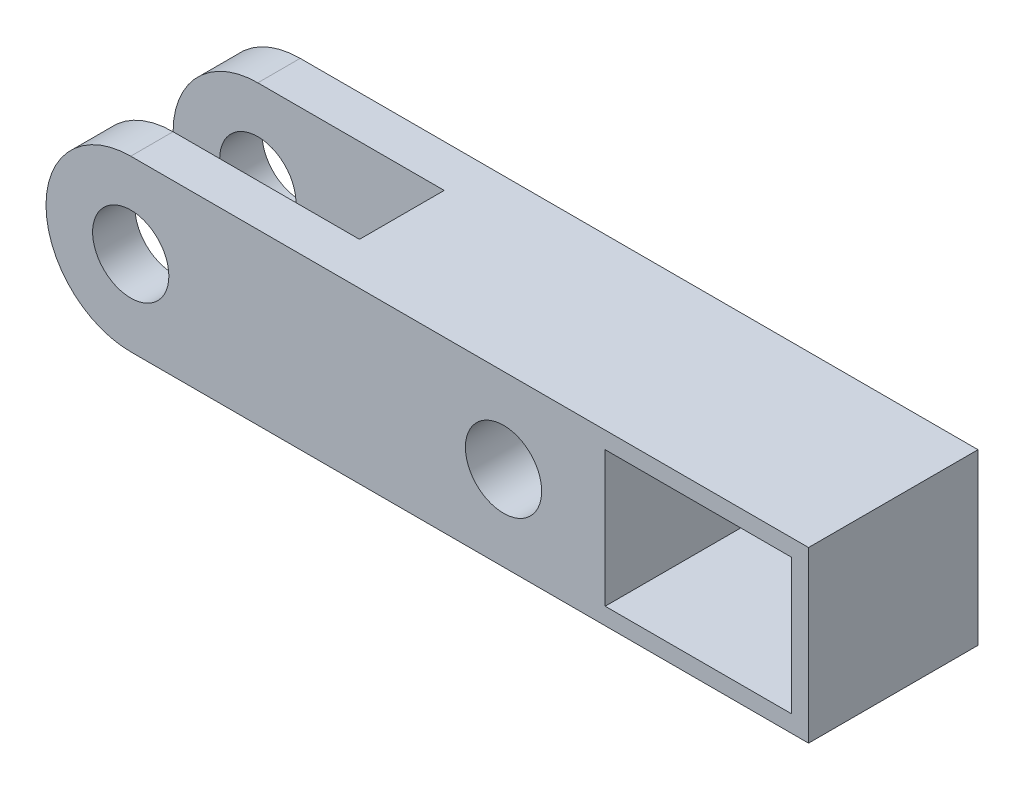
ISO-10303-21;
HEADER;
FILE_DESCRIPTION(('STEP AP214'),'2;1');
FILE_NAME('part.step','',(''),(''),'','','');
FILE_SCHEMA(('AUTOMOTIVE_DESIGN { 1 0 10303 214 1 1 1 1 }'));
ENDSEC;
DATA;
#1=APPLICATION_CONTEXT('core data for automotive mechanical design processes');
#2=APPLICATION_PROTOCOL_DEFINITION('international standard','automotive_design',2000,#1);
#3=PRODUCT_CONTEXT('',#1,'mechanical');
#4=PRODUCT('Part','Part','',(#3));
#5=PRODUCT_RELATED_PRODUCT_CATEGORY('part','',(#4));
#6=PRODUCT_DEFINITION_FORMATION('','',#4);
#7=PRODUCT_DEFINITION_CONTEXT('part definition',#1,'design');
#8=PRODUCT_DEFINITION('design','',#6,#7);
#9=PRODUCT_DEFINITION_SHAPE('','',#8);
#10=(LENGTH_UNIT() NAMED_UNIT(*) SI_UNIT(.MILLI.,.METRE.));
#11=(NAMED_UNIT(*) PLANE_ANGLE_UNIT() SI_UNIT($,.RADIAN.));
#12=(NAMED_UNIT(*) SI_UNIT($,.STERADIAN.) SOLID_ANGLE_UNIT());
#13=UNCERTAINTY_MEASURE_WITH_UNIT(LENGTH_MEASURE(1.E-05),#10,'distance_accuracy_value','');
#14=(GEOMETRIC_REPRESENTATION_CONTEXT(3) GLOBAL_UNCERTAINTY_ASSIGNED_CONTEXT((#13)) GLOBAL_UNIT_ASSIGNED_CONTEXT((#10,
#11,#12)) REPRESENTATION_CONTEXT('',''));
#15=CARTESIAN_POINT('',(0.,0.,0.));
#16=DIRECTION('',(0.,0.,1.));
#17=DIRECTION('',(1.,0.,0.));
#18=AXIS2_PLACEMENT_3D('',#15,#16,#17);
#19=CARTESIAN_POINT('',(0.,0.,5.));
#20=DIRECTION('',(0.,0.,-1.));
#21=DIRECTION('',(-1.,0.,0.));
#22=AXIS2_PLACEMENT_3D('',#19,#20,#21);
#23=CYLINDRICAL_SURFACE('',#22,5.);
#24=DIRECTION('',(0.,0.,-1.));
#25=VECTOR('',#24,1.);
#26=CARTESIAN_POINT('',(0.,5.,5.));
#27=LINE('',#26,#25);
#28=CARTESIAN_POINT('',(0.,5.,5.));
#29=VERTEX_POINT('',#28);
#30=CARTESIAN_POINT('',(0.,5.,2.5));
#31=VERTEX_POINT('',#30);
#32=EDGE_CURVE('E227',#29,#31,#27,.T.);
#33=ORIENTED_EDGE('',*,*,#32,.T.);
#34=CARTESIAN_POINT('',(0.,0.,2.5));
#35=DIRECTION('',(0.,0.,1.));
#36=DIRECTION('',(1.,0.,0.));
#37=AXIS2_PLACEMENT_3D('',#34,#35,#36);
#38=CIRCLE('',#37,5.);
#39=CARTESIAN_POINT('',(0.,-5.,2.5));
#40=VERTEX_POINT('',#39);
#41=EDGE_CURVE('E146',#31,#40,#38,.T.);
#42=ORIENTED_EDGE('',*,*,#41,.T.);
#43=DIRECTION('',(0.,0.,-1.));
#44=VECTOR('',#43,1.);
#45=CARTESIAN_POINT('',(0.,-5.,5.));
#46=LINE('',#45,#44);
#47=CARTESIAN_POINT('',(0.,-5.,5.));
#48=VERTEX_POINT('',#47);
#49=EDGE_CURVE('E11',#48,#40,#46,.T.);
#50=ORIENTED_EDGE('',*,*,#49,.F.);
#51=CARTESIAN_POINT('',(0.,0.,5.));
#52=DIRECTION('',(0.,0.,1.));
#53=DIRECTION('',(1.,0.,0.));
#54=AXIS2_PLACEMENT_3D('',#51,#52,#53);
#55=CIRCLE('',#54,5.);
#56=EDGE_CURVE('E208',#29,#48,#55,.T.);
#57=ORIENTED_EDGE('',*,*,#56,.F.);
#58=EDGE_LOOP('',(#33,#42,#50,#57));
#59=FACE_BOUND('',#58,.T.);
#60=ADVANCED_FACE('F40',(#59),#23,.T.);
#61=CARTESIAN_POINT('',(4.5553838479151E-12,-1.13936637902157E-10,5.));
#62=DIRECTION('',(0.,0.,-1.));
#63=DIRECTION('',(-1.,0.,0.));
#64=AXIS2_PLACEMENT_3D('',#61,#62,#63);
#65=CYLINDRICAL_SURFACE('',#64,2.25000000000002);
#66=CARTESIAN_POINT('',(4.5553838479151E-12,-1.13936637902157E-10,2.5));
#67=DIRECTION('',(0.,0.,1.));
#68=DIRECTION('',(1.,0.,0.));
#69=AXIS2_PLACEMENT_3D('',#66,#67,#68);
#70=CIRCLE('',#69,2.25000000000002);
#71=CARTESIAN_POINT('',(2.25000000000457,-1.13936637902157E-10,2.5));
#72=VERTEX_POINT('',#71);
#73=EDGE_CURVE('E44',#72,#72,#70,.T.);
#74=ORIENTED_EDGE('',*,*,#73,.F.);
#75=EDGE_LOOP('',(#74));
#76=FACE_BOUND('',#75,.T.);
#77=CARTESIAN_POINT('',(4.5553838479151E-12,-1.13936637902157E-10,5.));
#78=DIRECTION('',(0.,0.,1.));
#79=DIRECTION('',(1.,0.,0.));
#80=AXIS2_PLACEMENT_3D('',#77,#78,#79);
#81=CIRCLE('',#80,2.25000000000002);
#82=CARTESIAN_POINT('',(2.25000000000457,-1.13936637902157E-10,5.));
#83=VERTEX_POINT('',#82);
#84=EDGE_CURVE('E202',#83,#83,#81,.T.);
#85=ORIENTED_EDGE('',*,*,#84,.T.);
#86=EDGE_LOOP('',(#85));
#87=FACE_BOUND('',#86,.T.);
#88=ADVANCED_FACE('F245',(#76,#87),#65,.F.);
#89=CARTESIAN_POINT('',(0.,0.,5.));
#90=DIRECTION('',(0.,0.,1.));
#91=DIRECTION('',(1.,0.,0.));
#92=AXIS2_PLACEMENT_3D('',#89,#90,#91);
#93=PLANE('',#92);
#94=CARTESIAN_POINT('',(22.,0.,5.));
#95=DIRECTION('',(0.,0.,-1.));
#96=DIRECTION('',(-1.,0.,0.));
#97=AXIS2_PLACEMENT_3D('',#94,#95,#96);
#98=CIRCLE('',#97,2.25);
#99=CARTESIAN_POINT('',(19.75,0.,5.));
#100=VERTEX_POINT('',#99);
#101=EDGE_CURVE('E195',#100,#100,#98,.T.);
#102=ORIENTED_EDGE('',*,*,#101,.T.);
#103=EDGE_LOOP('',(#102));
#104=FACE_BOUND('',#103,.T.);
#105=ORIENTED_EDGE('',*,*,#56,.T.);
#106=DIRECTION('',(1.,0.,0.));
#107=VECTOR('',#106,1.);
#108=CARTESIAN_POINT('',(0.,-5.,5.));
#109=LINE('',#108,#107);
#110=CARTESIAN_POINT('',(40.,-5.,5.));
#111=VERTEX_POINT('',#110);
#112=EDGE_CURVE('E211',#48,#111,#109,.T.);
#113=ORIENTED_EDGE('',*,*,#112,.T.);
#114=DIRECTION('',(0.,1.,0.));
#115=VECTOR('',#114,1.);
#116=CARTESIAN_POINT('',(40.,5.,5.));
#117=LINE('',#116,#115);
#118=CARTESIAN_POINT('',(40.,5.,5.));
#119=VERTEX_POINT('',#118);
#120=EDGE_CURVE('E214',#111,#119,#117,.T.);
#121=ORIENTED_EDGE('',*,*,#120,.T.);
#122=DIRECTION('',(-1.,0.,0.));
#123=VECTOR('',#122,1.);
#124=CARTESIAN_POINT('',(0.,5.,5.));
#125=LINE('',#124,#123);
#126=EDGE_CURVE('E216',#119,#29,#125,.T.);
#127=ORIENTED_EDGE('',*,*,#126,.T.);
#128=EDGE_LOOP('',(#105,#113,#121,#127));
#129=FACE_BOUND('',#128,.T.);
#130=ORIENTED_EDGE('',*,*,#84,.F.);
#131=EDGE_LOOP('',(#130));
#132=FACE_BOUND('',#131,.T.);
#133=DIRECTION('',(-1.,0.,0.));
#134=VECTOR('',#133,1.);
#135=CARTESIAN_POINT('',(28.,-4.,5.));
#136=LINE('',#135,#134);
#137=CARTESIAN_POINT('',(39.,-4.,5.));
#138=VERTEX_POINT('',#137);
#139=CARTESIAN_POINT('',(28.,-4.,5.));
#140=VERTEX_POINT('',#139);
#141=EDGE_CURVE('E171',#138,#140,#136,.T.);
#142=ORIENTED_EDGE('',*,*,#141,.T.);
#143=DIRECTION('',(0.,1.,0.));
#144=VECTOR('',#143,1.);
#145=CARTESIAN_POINT('',(28.,-4.,5.));
#146=LINE('',#145,#144);
#147=CARTESIAN_POINT('',(28.,4.,5.));
#148=VERTEX_POINT('',#147);
#149=EDGE_CURVE('E65',#140,#148,#146,.T.);
#150=ORIENTED_EDGE('',*,*,#149,.T.);
#151=DIRECTION('',(1.,0.,0.));
#152=VECTOR('',#151,1.);
#153=CARTESIAN_POINT('',(28.,4.,5.));
#154=LINE('',#153,#152);
#155=CARTESIAN_POINT('',(39.,4.,5.));
#156=VERTEX_POINT('',#155);
#157=EDGE_CURVE('E180',#148,#156,#154,.T.);
#158=ORIENTED_EDGE('',*,*,#157,.T.);
#159=DIRECTION('',(0.,-1.,0.));
#160=VECTOR('',#159,1.);
#161=CARTESIAN_POINT('',(39.,-4.,5.));
#162=LINE('',#161,#160);
#163=EDGE_CURVE('E183',#156,#138,#162,.T.);
#164=ORIENTED_EDGE('',*,*,#163,.T.);
#165=EDGE_LOOP('',(#142,#150,#158,#164));
#166=FACE_BOUND('',#165,.T.);
#167=ADVANCED_FACE('F251',(#104,#129,#132,#166),#93,.T.);
#168=CARTESIAN_POINT('',(0.,0.,-5.));
#169=DIRECTION('',(0.,0.,1.));
#170=DIRECTION('',(1.,0.,0.));
#171=AXIS2_PLACEMENT_3D('',#168,#169,#170);
#172=PLANE('',#171);
#173=CARTESIAN_POINT('',(4.5553838479151E-12,-1.13936637902157E-10,-5.));
#174=DIRECTION('',(0.,0.,1.));
#175=DIRECTION('',(1.,0.,0.));
#176=AXIS2_PLACEMENT_3D('',#173,#174,#175);
#177=CIRCLE('',#176,2.25000000000002);
#178=CARTESIAN_POINT('',(2.25000000000457,-1.13936637902157E-10,-5.));
#179=VERTEX_POINT('',#178);
#180=EDGE_CURVE('E199',#179,#179,#177,.T.);
#181=ORIENTED_EDGE('',*,*,#180,.T.);
#182=EDGE_LOOP('',(#181));
#183=FACE_BOUND('',#182,.T.);
#184=CARTESIAN_POINT('',(0.,0.,-5.));
#185=DIRECTION('',(0.,0.,1.));
#186=DIRECTION('',(1.,0.,0.));
#187=AXIS2_PLACEMENT_3D('',#184,#185,#186);
#188=CIRCLE('',#187,5.);
#189=CARTESIAN_POINT('',(0.,5.,-5.));
#190=VERTEX_POINT('',#189);
#191=CARTESIAN_POINT('',(0.,-5.,-5.));
#192=VERTEX_POINT('',#191);
#193=EDGE_CURVE('E205',#190,#192,#188,.T.);
#194=ORIENTED_EDGE('',*,*,#193,.F.);
#195=DIRECTION('',(-1.,0.,0.));
#196=VECTOR('',#195,1.);
#197=CARTESIAN_POINT('',(0.,5.,-5.));
#198=LINE('',#197,#196);
#199=CARTESIAN_POINT('',(40.,5.,-5.));
#200=VERTEX_POINT('',#199);
#201=EDGE_CURVE('E212',#200,#190,#198,.T.);
#202=ORIENTED_EDGE('',*,*,#201,.F.);
#203=DIRECTION('',(0.,1.,0.));
#204=VECTOR('',#203,1.);
#205=CARTESIAN_POINT('',(40.,5.,-5.));
#206=LINE('',#205,#204);
#207=CARTESIAN_POINT('',(40.,-5.,-5.));
#208=VERTEX_POINT('',#207);
#209=EDGE_CURVE('E223',#208,#200,#206,.T.);
#210=ORIENTED_EDGE('',*,*,#209,.F.);
#211=DIRECTION('',(1.,0.,0.));
#212=VECTOR('',#211,1.);
#213=CARTESIAN_POINT('',(0.,-5.,-5.));
#214=LINE('',#213,#212);
#215=EDGE_CURVE('E221',#192,#208,#214,.T.);
#216=ORIENTED_EDGE('',*,*,#215,.F.);
#217=EDGE_LOOP('',(#194,#202,#210,#216));
#218=FACE_BOUND('',#217,.T.);
#219=CARTESIAN_POINT('',(22.,0.,-5.));
#220=DIRECTION('',(0.,0.,-1.));
#221=DIRECTION('',(-1.,0.,0.));
#222=AXIS2_PLACEMENT_3D('',#219,#220,#221);
#223=CIRCLE('',#222,2.25);
#224=CARTESIAN_POINT('',(19.75,0.,-5.));
#225=VERTEX_POINT('',#224);
#226=EDGE_CURVE('E196',#225,#225,#223,.T.);
#227=ORIENTED_EDGE('',*,*,#226,.F.);
#228=EDGE_LOOP('',(#227));
#229=FACE_BOUND('',#228,.T.);
#230=DIRECTION('',(0.,1.,0.));
#231=VECTOR('',#230,1.);
#232=CARTESIAN_POINT('',(28.,-4.,-5.));
#233=LINE('',#232,#231);
#234=CARTESIAN_POINT('',(28.,-4.,-5.));
#235=VERTEX_POINT('',#234);
#236=CARTESIAN_POINT('',(28.,4.,-5.));
#237=VERTEX_POINT('',#236);
#238=EDGE_CURVE('E168',#235,#237,#233,.T.);
#239=ORIENTED_EDGE('',*,*,#238,.F.);
#240=DIRECTION('',(-1.,0.,0.));
#241=VECTOR('',#240,1.);
#242=CARTESIAN_POINT('',(28.,-4.,-5.));
#243=LINE('',#242,#241);
#244=CARTESIAN_POINT('',(39.,-4.,-5.));
#245=VERTEX_POINT('',#244);
#246=EDGE_CURVE('E176',#245,#235,#243,.T.);
#247=ORIENTED_EDGE('',*,*,#246,.F.);
#248=DIRECTION('',(0.,-1.,0.));
#249=VECTOR('',#248,1.);
#250=CARTESIAN_POINT('',(39.,-4.,-5.));
#251=LINE('',#250,#249);
#252=CARTESIAN_POINT('',(39.,4.,-5.));
#253=VERTEX_POINT('',#252);
#254=EDGE_CURVE('E173',#253,#245,#251,.T.);
#255=ORIENTED_EDGE('',*,*,#254,.F.);
#256=DIRECTION('',(1.,0.,0.));
#257=VECTOR('',#256,1.);
#258=CARTESIAN_POINT('',(28.,4.,-5.));
#259=LINE('',#258,#257);
#260=EDGE_CURVE('E170',#237,#253,#259,.T.);
#261=ORIENTED_EDGE('',*,*,#260,.F.);
#262=EDGE_LOOP('',(#239,#247,#255,#261));
#263=FACE_BOUND('',#262,.T.);
#264=ADVANCED_FACE('F248',(#183,#218,#229,#263),#172,.F.);
#265=CARTESIAN_POINT('',(0.,0.,-2.5));
#266=DIRECTION('',(0.,0.,-1.));
#267=DIRECTION('',(-1.,0.,0.));
#268=AXIS2_PLACEMENT_3D('',#265,#266,#267);
#269=CIRCLE('',#268,5.);
#270=CARTESIAN_POINT('',(0.,-5.,-2.5));
#271=VERTEX_POINT('',#270);
#272=CARTESIAN_POINT('',(0.,5.,-2.5));
#273=VERTEX_POINT('',#272);
#274=EDGE_CURVE('E165',#271,#273,#269,.T.);
#275=ORIENTED_EDGE('',*,*,#274,.T.);
#276=EDGE_CURVE('E218',#273,#190,#27,.T.);
#277=ORIENTED_EDGE('',*,*,#276,.T.);
#278=ORIENTED_EDGE('',*,*,#193,.T.);
#279=EDGE_CURVE('E49',#271,#192,#46,.T.);
#280=ORIENTED_EDGE('',*,*,#279,.F.);
#281=EDGE_LOOP('',(#275,#277,#278,#280));
#282=FACE_BOUND('',#281,.T.);
#283=ADVANCED_FACE('F42',(#282),#23,.T.);
#284=CARTESIAN_POINT('',(0.,-5.,5.));
#285=DIRECTION('',(0.,1.,0.));
#286=DIRECTION('',(0.,0.,1.));
#287=AXIS2_PLACEMENT_3D('',#284,#285,#286);
#288=PLANE('',#287);
#289=ORIENTED_EDGE('',*,*,#49,.T.);
#290=DIRECTION('',(-1.,0.,0.));
#291=VECTOR('',#290,1.);
#292=CARTESIAN_POINT('',(-5.,-5.,2.5));
#293=LINE('',#292,#291);
#294=CARTESIAN_POINT('',(11.,-5.,2.5));
#295=VERTEX_POINT('',#294);
#296=EDGE_CURVE('E157',#295,#40,#293,.T.);
#297=ORIENTED_EDGE('',*,*,#296,.F.);
#298=DIRECTION('',(0.,0.,1.));
#299=VECTOR('',#298,1.);
#300=CARTESIAN_POINT('',(11.,-5.,-2.5));
#301=LINE('',#300,#299);
#302=CARTESIAN_POINT('',(11.,-5.,-2.5));
#303=VERTEX_POINT('',#302);
#304=EDGE_CURVE('E136',#303,#295,#301,.T.);
#305=ORIENTED_EDGE('',*,*,#304,.F.);
#306=DIRECTION('',(1.,0.,0.));
#307=VECTOR('',#306,1.);
#308=CARTESIAN_POINT('',(-5.,-5.,-2.5));
#309=LINE('',#308,#307);
#310=EDGE_CURVE('E160',#271,#303,#309,.T.);
#311=ORIENTED_EDGE('',*,*,#310,.F.);
#312=ORIENTED_EDGE('',*,*,#279,.T.);
#313=ORIENTED_EDGE('',*,*,#215,.T.);
#314=DIRECTION('',(0.,0.,-1.));
#315=VECTOR('',#314,1.);
#316=CARTESIAN_POINT('',(40.,-5.,5.));
#317=LINE('',#316,#315);
#318=EDGE_CURVE('E232',#111,#208,#317,.T.);
#319=ORIENTED_EDGE('',*,*,#318,.F.);
#320=ORIENTED_EDGE('',*,*,#112,.F.);
#321=EDGE_LOOP('',(#289,#297,#305,#311,#312,#313,#319,#320));
#322=FACE_BOUND('',#321,.T.);
#323=ADVANCED_FACE('F290',(#322),#288,.F.);
#324=CARTESIAN_POINT('',(40.,5.,5.));
#325=DIRECTION('',(-1.,0.,0.));
#326=DIRECTION('',(0.,0.,1.));
#327=AXIS2_PLACEMENT_3D('',#324,#325,#326);
#328=PLANE('',#327);
#329=ORIENTED_EDGE('',*,*,#209,.T.);
#330=DIRECTION('',(0.,0.,-1.));
#331=VECTOR('',#330,1.);
#332=CARTESIAN_POINT('',(40.,5.,5.));
#333=LINE('',#332,#331);
#334=EDGE_CURVE('E229',#119,#200,#333,.T.);
#335=ORIENTED_EDGE('',*,*,#334,.F.);
#336=ORIENTED_EDGE('',*,*,#120,.F.);
#337=ORIENTED_EDGE('',*,*,#318,.T.);
#338=EDGE_LOOP('',(#329,#335,#336,#337));
#339=FACE_BOUND('',#338,.T.);
#340=ADVANCED_FACE('F295',(#339),#328,.F.);
#341=CARTESIAN_POINT('',(0.,5.,5.));
#342=DIRECTION('',(0.,-1.,0.));
#343=DIRECTION('',(0.,0.,-1.));
#344=AXIS2_PLACEMENT_3D('',#341,#342,#343);
#345=PLANE('',#344);
#346=DIRECTION('',(0.,0.,1.));
#347=VECTOR('',#346,1.);
#348=CARTESIAN_POINT('',(11.,5.,-2.5));
#349=LINE('',#348,#347);
#350=CARTESIAN_POINT('',(11.,5.,-2.5));
#351=VERTEX_POINT('',#350);
#352=CARTESIAN_POINT('',(11.,5.,2.5));
#353=VERTEX_POINT('',#352);
#354=EDGE_CURVE('E57',#351,#353,#349,.T.);
#355=ORIENTED_EDGE('',*,*,#354,.T.);
#356=DIRECTION('',(-1.,0.,0.));
#357=VECTOR('',#356,1.);
#358=CARTESIAN_POINT('',(-5.,5.,2.5));
#359=LINE('',#358,#357);
#360=EDGE_CURVE('E144',#353,#31,#359,.T.);
#361=ORIENTED_EDGE('',*,*,#360,.T.);
#362=ORIENTED_EDGE('',*,*,#32,.F.);
#363=ORIENTED_EDGE('',*,*,#126,.F.);
#364=ORIENTED_EDGE('',*,*,#334,.T.);
#365=ORIENTED_EDGE('',*,*,#201,.T.);
#366=ORIENTED_EDGE('',*,*,#276,.F.);
#367=DIRECTION('',(1.,0.,0.));
#368=VECTOR('',#367,1.);
#369=CARTESIAN_POINT('',(-5.,5.,-2.5));
#370=LINE('',#369,#368);
#371=EDGE_CURVE('E155',#273,#351,#370,.T.);
#372=ORIENTED_EDGE('',*,*,#371,.T.);
#373=EDGE_LOOP('',(#355,#361,#362,#363,#364,#365,#366,#372));
#374=FACE_BOUND('',#373,.T.);
#375=ADVANCED_FACE('F152',(#374),#345,.F.);
#376=CARTESIAN_POINT('',(4.5553838479151E-12,-1.13936637902157E-10,-2.5));
#377=DIRECTION('',(0.,0.,-1.));
#378=DIRECTION('',(-1.,0.,0.));
#379=AXIS2_PLACEMENT_3D('',#376,#377,#378);
#380=CIRCLE('',#379,2.25000000000002);
#381=CARTESIAN_POINT('',(-2.24999999999546,-1.13936637902157E-10,-2.5));
#382=VERTEX_POINT('',#381);
#383=EDGE_CURVE('E140',#382,#382,#380,.T.);
#384=ORIENTED_EDGE('',*,*,#383,.F.);
#385=EDGE_LOOP('',(#384));
#386=FACE_BOUND('',#385,.T.);
#387=ORIENTED_EDGE('',*,*,#180,.F.);
#388=EDGE_LOOP('',(#387));
#389=FACE_BOUND('',#388,.T.);
#390=ADVANCED_FACE('F240',(#386,#389),#65,.F.);
#391=CARTESIAN_POINT('',(22.,0.,-5.));
#392=DIRECTION('',(0.,0.,1.));
#393=DIRECTION('',(1.,0.,0.));
#394=AXIS2_PLACEMENT_3D('',#391,#392,#393);
#395=CYLINDRICAL_SURFACE('',#394,2.25);
#396=ORIENTED_EDGE('',*,*,#226,.T.);
#397=EDGE_LOOP('',(#396));
#398=FACE_BOUND('',#397,.T.);
#399=ORIENTED_EDGE('',*,*,#101,.F.);
#400=EDGE_LOOP('',(#399));
#401=FACE_BOUND('',#400,.T.);
#402=ADVANCED_FACE('F243',(#398,#401),#395,.F.);
#403=CARTESIAN_POINT('',(28.,-4.,-5.));
#404=DIRECTION('',(1.,0.,0.));
#405=DIRECTION('',(0.,0.,-1.));
#406=AXIS2_PLACEMENT_3D('',#403,#404,#405);
#407=PLANE('',#406);
#408=ORIENTED_EDGE('',*,*,#149,.F.);
#409=DIRECTION('',(0.,0.,1.));
#410=VECTOR('',#409,1.);
#411=CARTESIAN_POINT('',(28.,-4.,-5.));
#412=LINE('',#411,#410);
#413=EDGE_CURVE('E178',#235,#140,#412,.T.);
#414=ORIENTED_EDGE('',*,*,#413,.F.);
#415=ORIENTED_EDGE('',*,*,#238,.T.);
#416=DIRECTION('',(0.,0.,1.));
#417=VECTOR('',#416,1.);
#418=CARTESIAN_POINT('',(28.,4.,-5.));
#419=LINE('',#418,#417);
#420=EDGE_CURVE('E193',#237,#148,#419,.T.);
#421=ORIENTED_EDGE('',*,*,#420,.T.);
#422=EDGE_LOOP('',(#408,#414,#415,#421));
#423=FACE_BOUND('',#422,.T.);
#424=ADVANCED_FACE('F264',(#423),#407,.T.);
#425=CARTESIAN_POINT('',(28.,4.,-5.));
#426=DIRECTION('',(0.,-1.,0.));
#427=DIRECTION('',(1.,0.,0.));
#428=AXIS2_PLACEMENT_3D('',#425,#426,#427);
#429=PLANE('',#428);
#430=ORIENTED_EDGE('',*,*,#157,.F.);
#431=ORIENTED_EDGE('',*,*,#420,.F.);
#432=ORIENTED_EDGE('',*,*,#260,.T.);
#433=DIRECTION('',(0.,0.,1.));
#434=VECTOR('',#433,1.);
#435=CARTESIAN_POINT('',(39.,4.,-5.));
#436=LINE('',#435,#434);
#437=EDGE_CURVE('E191',#253,#156,#436,.T.);
#438=ORIENTED_EDGE('',*,*,#437,.T.);
#439=EDGE_LOOP('',(#430,#431,#432,#438));
#440=FACE_BOUND('',#439,.T.);
#441=ADVANCED_FACE('F266',(#440),#429,.T.);
#442=CARTESIAN_POINT('',(39.,-4.,-5.));
#443=DIRECTION('',(-1.,0.,0.));
#444=DIRECTION('',(0.,0.,1.));
#445=AXIS2_PLACEMENT_3D('',#442,#443,#444);
#446=PLANE('',#445);
#447=ORIENTED_EDGE('',*,*,#163,.F.);
#448=ORIENTED_EDGE('',*,*,#437,.F.);
#449=ORIENTED_EDGE('',*,*,#254,.T.);
#450=DIRECTION('',(0.,0.,1.));
#451=VECTOR('',#450,1.);
#452=CARTESIAN_POINT('',(39.,-4.,-5.));
#453=LINE('',#452,#451);
#454=EDGE_CURVE('E189',#245,#138,#453,.T.);
#455=ORIENTED_EDGE('',*,*,#454,.T.);
#456=EDGE_LOOP('',(#447,#448,#449,#455));
#457=FACE_BOUND('',#456,.T.);
#458=ADVANCED_FACE('F274',(#457),#446,.T.);
#459=CARTESIAN_POINT('',(28.,-4.,-5.));
#460=DIRECTION('',(0.,1.,0.));
#461=DIRECTION('',(-1.,0.,0.));
#462=AXIS2_PLACEMENT_3D('',#459,#460,#461);
#463=PLANE('',#462);
#464=ORIENTED_EDGE('',*,*,#141,.F.);
#465=ORIENTED_EDGE('',*,*,#454,.F.);
#466=ORIENTED_EDGE('',*,*,#246,.T.);
#467=ORIENTED_EDGE('',*,*,#413,.T.);
#468=EDGE_LOOP('',(#464,#465,#466,#467));
#469=FACE_BOUND('',#468,.T.);
#470=ADVANCED_FACE('F272',(#469),#463,.T.);
#471=CARTESIAN_POINT('',(-5.,5.,2.5));
#472=DIRECTION('',(0.,0.,1.));
#473=DIRECTION('',(1.,0.,0.));
#474=AXIS2_PLACEMENT_3D('',#471,#472,#473);
#475=PLANE('',#474);
#476=ORIENTED_EDGE('',*,*,#73,.T.);
#477=EDGE_LOOP('',(#476));
#478=FACE_BOUND('',#477,.T.);
#479=ORIENTED_EDGE('',*,*,#360,.F.);
#480=DIRECTION('',(0.,-1.,0.));
#481=VECTOR('',#480,1.);
#482=CARTESIAN_POINT('',(11.,5.,2.5));
#483=LINE('',#482,#481);
#484=EDGE_CURVE('E132',#353,#295,#483,.T.);
#485=ORIENTED_EDGE('',*,*,#484,.T.);
#486=ORIENTED_EDGE('',*,*,#296,.T.);
#487=ORIENTED_EDGE('',*,*,#41,.F.);
#488=EDGE_LOOP('',(#479,#485,#486,#487));
#489=FACE_BOUND('',#488,.T.);
#490=ADVANCED_FACE('F145',(#478,#489),#475,.F.);
#491=CARTESIAN_POINT('',(-5.,5.,-2.5));
#492=DIRECTION('',(0.,0.,-1.));
#493=DIRECTION('',(-1.,0.,0.));
#494=AXIS2_PLACEMENT_3D('',#491,#492,#493);
#495=PLANE('',#494);
#496=ORIENTED_EDGE('',*,*,#383,.T.);
#497=EDGE_LOOP('',(#496));
#498=FACE_BOUND('',#497,.T.);
#499=ORIENTED_EDGE('',*,*,#274,.F.);
#500=ORIENTED_EDGE('',*,*,#310,.T.);
#501=DIRECTION('',(0.,-1.,0.));
#502=VECTOR('',#501,1.);
#503=CARTESIAN_POINT('',(11.,5.,-2.5));
#504=LINE('',#503,#502);
#505=EDGE_CURVE('E141',#351,#303,#504,.T.);
#506=ORIENTED_EDGE('',*,*,#505,.F.);
#507=ORIENTED_EDGE('',*,*,#371,.F.);
#508=EDGE_LOOP('',(#499,#500,#506,#507));
#509=FACE_BOUND('',#508,.T.);
#510=ADVANCED_FACE('F237',(#498,#509),#495,.F.);
#511=CARTESIAN_POINT('',(11.,5.,-2.5));
#512=DIRECTION('',(1.,0.,0.));
#513=DIRECTION('',(0.,0.,-1.));
#514=AXIS2_PLACEMENT_3D('',#511,#512,#513);
#515=PLANE('',#514);
#516=ORIENTED_EDGE('',*,*,#304,.T.);
#517=ORIENTED_EDGE('',*,*,#484,.F.);
#518=ORIENTED_EDGE('',*,*,#354,.F.);
#519=ORIENTED_EDGE('',*,*,#505,.T.);
#520=EDGE_LOOP('',(#516,#517,#518,#519));
#521=FACE_BOUND('',#520,.T.);
#522=ADVANCED_FACE('F134',(#521),#515,.F.);
#523=CLOSED_SHELL('',(#60,#88,#167,#264,#283,#323,#340,#375,#390,#402,#424,#441,#458,#470,#490,
#510,#522));
#524=MANIFOLD_SOLID_BREP('B2',#523);
#525=ADVANCED_BREP_SHAPE_REPRESENTATION('',(#18,#524),#14);
#526=SHAPE_DEFINITION_REPRESENTATION(#9,#525);
ENDSEC;
END-ISO-10303-21;
